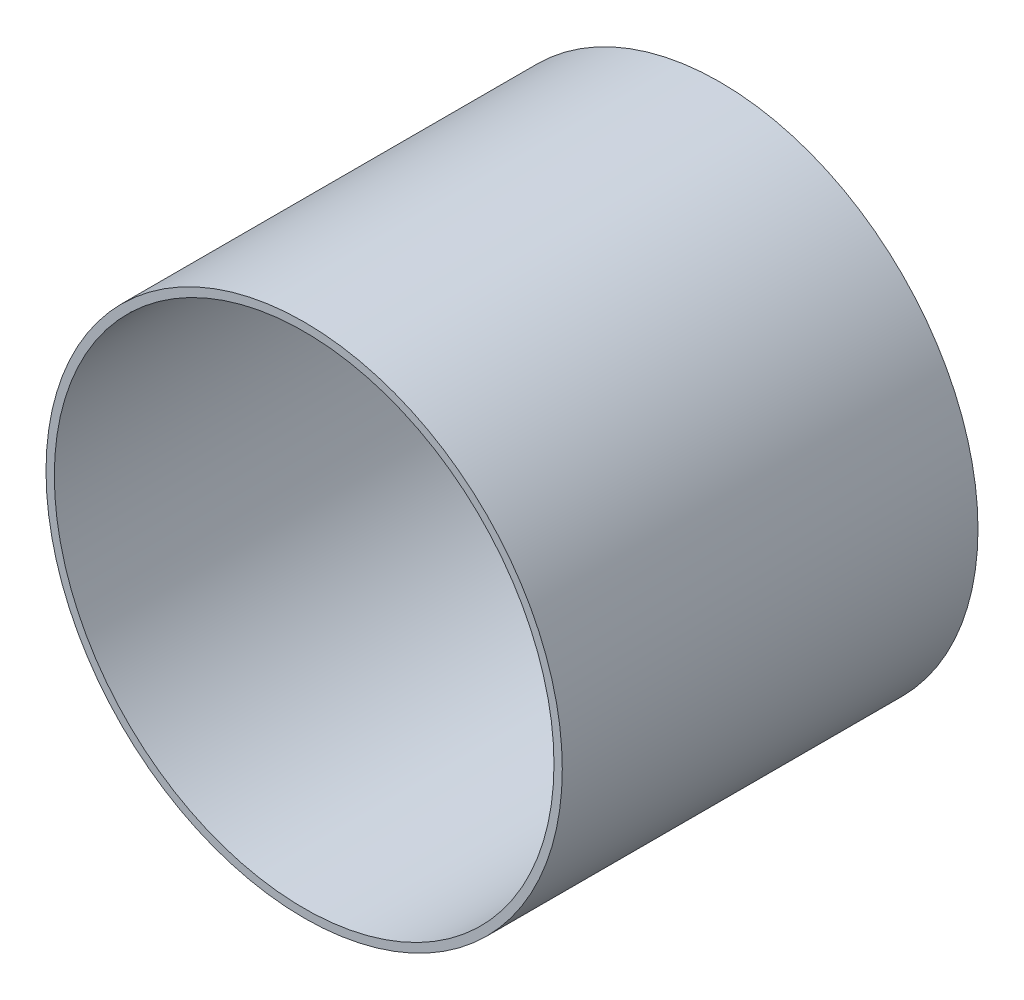
ISO-10303-21;
HEADER;
FILE_DESCRIPTION(('STEP AP214'),'2;1');
FILE_NAME('part.step','',(''),(''),'','','');
FILE_SCHEMA(('AUTOMOTIVE_DESIGN { 1 0 10303 214 1 1 1 1 }'));
ENDSEC;
DATA;
#1=APPLICATION_CONTEXT('core data for automotive mechanical design processes');
#2=APPLICATION_PROTOCOL_DEFINITION('international standard','automotive_design',2000,#1);
#3=PRODUCT_CONTEXT('',#1,'mechanical');
#4=PRODUCT('Part','Part','',(#3));
#5=PRODUCT_RELATED_PRODUCT_CATEGORY('part','',(#4));
#6=PRODUCT_DEFINITION_FORMATION('','',#4);
#7=PRODUCT_DEFINITION_CONTEXT('part definition',#1,'design');
#8=PRODUCT_DEFINITION('design','',#6,#7);
#9=PRODUCT_DEFINITION_SHAPE('','',#8);
#10=(LENGTH_UNIT() NAMED_UNIT(*) SI_UNIT(.MILLI.,.METRE.));
#11=(NAMED_UNIT(*) PLANE_ANGLE_UNIT() SI_UNIT($,.RADIAN.));
#12=(NAMED_UNIT(*) SI_UNIT($,.STERADIAN.) SOLID_ANGLE_UNIT());
#13=UNCERTAINTY_MEASURE_WITH_UNIT(LENGTH_MEASURE(1.E-05),#10,'distance_accuracy_value','');
#14=(GEOMETRIC_REPRESENTATION_CONTEXT(3) GLOBAL_UNCERTAINTY_ASSIGNED_CONTEXT((#13)) GLOBAL_UNIT_ASSIGNED_CONTEXT((#10,
#11,#12)) REPRESENTATION_CONTEXT('',''));
#15=CARTESIAN_POINT('',(0.,0.,0.));
#16=DIRECTION('',(0.,0.,1.));
#17=DIRECTION('',(1.,0.,0.));
#18=AXIS2_PLACEMENT_3D('',#15,#16,#17);
#19=CARTESIAN_POINT('',(0.,0.,50.));
#20=DIRECTION('',(0.,0.,1.));
#21=DIRECTION('',(1.,0.,0.));
#22=AXIS2_PLACEMENT_3D('',#19,#20,#21);
#23=PLANE('',#22);
#24=CARTESIAN_POINT('',(0.,0.,50.));
#25=DIRECTION('',(0.,0.,1.));
#26=DIRECTION('',(1.,0.,0.));
#27=AXIS2_PLACEMENT_3D('',#24,#25,#26);
#28=CIRCLE('',#27,31.05);
#29=CARTESIAN_POINT('',(31.05,0.,50.));
#30=VERTEX_POINT('',#29);
#31=EDGE_CURVE('E10',#30,#30,#28,.T.);
#32=ORIENTED_EDGE('',*,*,#31,.T.);
#33=EDGE_LOOP('',(#32));
#34=FACE_BOUND('',#33,.T.);
#35=CARTESIAN_POINT('',(0.,0.,50.));
#36=DIRECTION('',(0.,0.,1.));
#37=DIRECTION('',(1.,0.,0.));
#38=AXIS2_PLACEMENT_3D('',#35,#36,#37);
#39=CIRCLE('',#38,30.05);
#40=CARTESIAN_POINT('',(30.05,0.,50.));
#41=VERTEX_POINT('',#40);
#42=EDGE_CURVE('E50',#41,#41,#39,.T.);
#43=ORIENTED_EDGE('',*,*,#42,.F.);
#44=EDGE_LOOP('',(#43));
#45=FACE_BOUND('',#44,.T.);
#46=ADVANCED_FACE('F39',(#34,#45),#23,.T.);
#47=CARTESIAN_POINT('',(0.,0.,0.));
#48=DIRECTION('',(0.,0.,1.));
#49=DIRECTION('',(1.,0.,0.));
#50=AXIS2_PLACEMENT_3D('',#47,#48,#49);
#51=PLANE('',#50);
#52=CARTESIAN_POINT('',(0.,0.,0.));
#53=DIRECTION('',(0.,0.,1.));
#54=DIRECTION('',(1.,0.,0.));
#55=AXIS2_PLACEMENT_3D('',#52,#53,#54);
#56=CIRCLE('',#55,31.05);
#57=CARTESIAN_POINT('',(31.05,0.,0.));
#58=VERTEX_POINT('',#57);
#59=EDGE_CURVE('E43',#58,#58,#56,.T.);
#60=ORIENTED_EDGE('',*,*,#59,.F.);
#61=EDGE_LOOP('',(#60));
#62=FACE_BOUND('',#61,.T.);
#63=CARTESIAN_POINT('',(0.,0.,0.));
#64=DIRECTION('',(0.,0.,1.));
#65=DIRECTION('',(1.,0.,0.));
#66=AXIS2_PLACEMENT_3D('',#63,#64,#65);
#67=CIRCLE('',#66,30.05);
#68=CARTESIAN_POINT('',(30.05,0.,0.));
#69=VERTEX_POINT('',#68);
#70=EDGE_CURVE('E52',#69,#69,#67,.T.);
#71=ORIENTED_EDGE('',*,*,#70,.T.);
#72=EDGE_LOOP('',(#71));
#73=FACE_BOUND('',#72,.T.);
#74=ADVANCED_FACE('F62',(#62,#73),#51,.F.);
#75=CARTESIAN_POINT('',(0.,0.,50.));
#76=DIRECTION('',(0.,0.,-1.));
#77=DIRECTION('',(-1.,0.,0.));
#78=AXIS2_PLACEMENT_3D('',#75,#76,#77);
#79=CYLINDRICAL_SURFACE('',#78,31.05);
#80=ORIENTED_EDGE('',*,*,#31,.F.);
#81=EDGE_LOOP('',(#80));
#82=FACE_BOUND('',#81,.T.);
#83=ORIENTED_EDGE('',*,*,#59,.T.);
#84=EDGE_LOOP('',(#83));
#85=FACE_BOUND('',#84,.T.);
#86=ADVANCED_FACE('F41',(#82,#85),#79,.T.);
#87=CARTESIAN_POINT('',(0.,0.,50.));
#88=DIRECTION('',(0.,0.,-1.));
#89=DIRECTION('',(-1.,0.,0.));
#90=AXIS2_PLACEMENT_3D('',#87,#88,#89);
#91=CYLINDRICAL_SURFACE('',#90,30.05);
#92=ORIENTED_EDGE('',*,*,#42,.T.);
#93=EDGE_LOOP('',(#92));
#94=FACE_BOUND('',#93,.T.);
#95=ORIENTED_EDGE('',*,*,#70,.F.);
#96=EDGE_LOOP('',(#95));
#97=FACE_BOUND('',#96,.T.);
#98=ADVANCED_FACE('F58',(#94,#97),#91,.F.);
#99=CLOSED_SHELL('',(#46,#74,#86,#98));
#100=MANIFOLD_SOLID_BREP('B2',#99);
#101=ADVANCED_BREP_SHAPE_REPRESENTATION('',(#18,#100),#14);
#102=SHAPE_DEFINITION_REPRESENTATION(#9,#101);
ENDSEC;
END-ISO-10303-21;
